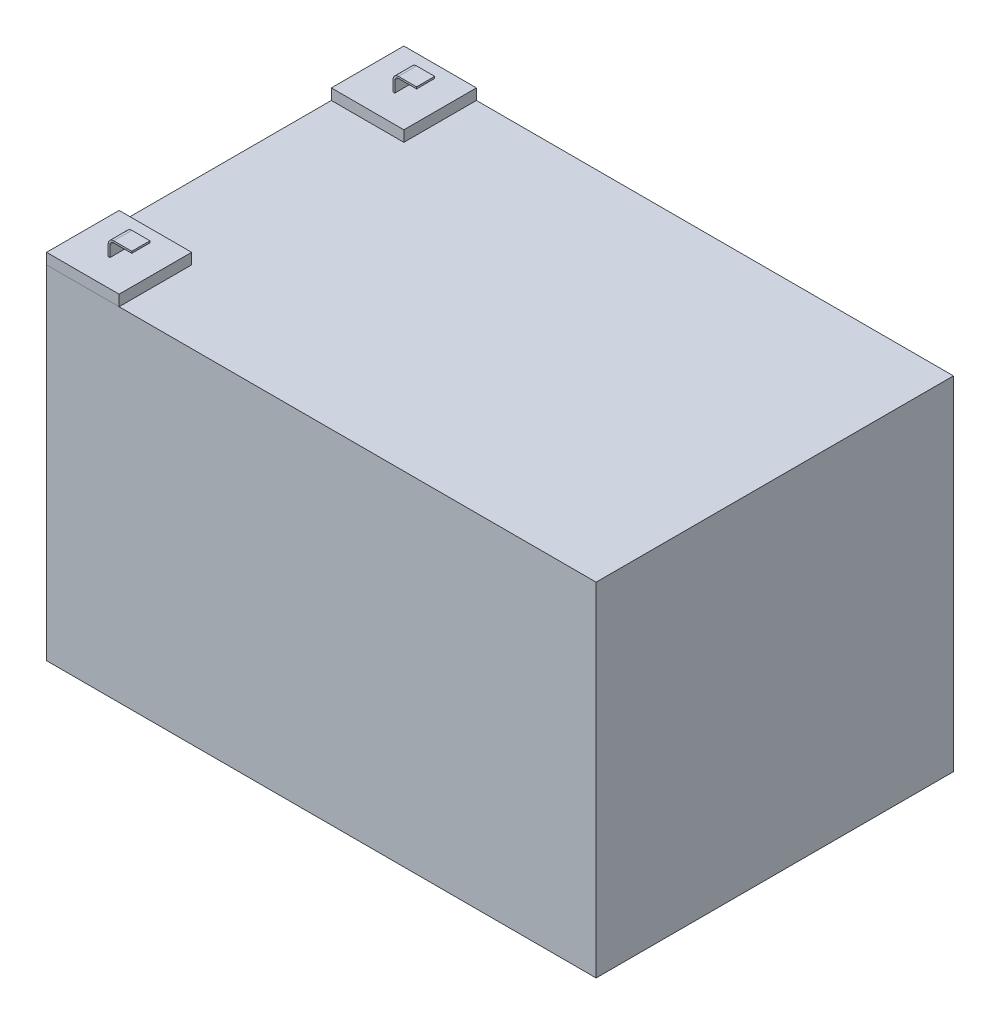
ISO-10303-21;
HEADER;
FILE_DESCRIPTION(('STEP AP214'),'2;1');
FILE_NAME('part.step','',(''),(''),'','','');
FILE_SCHEMA(('AUTOMOTIVE_DESIGN { 1 0 10303 214 1 1 1 1 }'));
ENDSEC;
DATA;
#1=APPLICATION_CONTEXT('core data for automotive mechanical design processes');
#2=APPLICATION_PROTOCOL_DEFINITION('international standard','automotive_design',2000,#1);
#3=PRODUCT_CONTEXT('',#1,'mechanical');
#4=PRODUCT('Part','Part','',(#3));
#5=PRODUCT_RELATED_PRODUCT_CATEGORY('part','',(#4));
#6=PRODUCT_DEFINITION_FORMATION('','',#4);
#7=PRODUCT_DEFINITION_CONTEXT('part definition',#1,'design');
#8=PRODUCT_DEFINITION('design','',#6,#7);
#9=PRODUCT_DEFINITION_SHAPE('','',#8);
#10=(LENGTH_UNIT() NAMED_UNIT(*) SI_UNIT(.MILLI.,.METRE.));
#11=(NAMED_UNIT(*) PLANE_ANGLE_UNIT() SI_UNIT($,.RADIAN.));
#12=(NAMED_UNIT(*) SI_UNIT($,.STERADIAN.) SOLID_ANGLE_UNIT());
#13=UNCERTAINTY_MEASURE_WITH_UNIT(LENGTH_MEASURE(1.E-05),#10,'distance_accuracy_value','');
#14=(GEOMETRIC_REPRESENTATION_CONTEXT(3) GLOBAL_UNCERTAINTY_ASSIGNED_CONTEXT((#13)) GLOBAL_UNIT_ASSIGNED_CONTEXT((#10,
#11,#12)) REPRESENTATION_CONTEXT('',''));
#15=CARTESIAN_POINT('',(0.,0.,0.));
#16=DIRECTION('',(0.,0.,1.));
#17=DIRECTION('',(1.,0.,0.));
#18=AXIS2_PLACEMENT_3D('',#15,#16,#17);
#19=CARTESIAN_POINT('',(-65.75,97.5,-36.75));
#20=DIRECTION('',(0.,-1.,0.));
#21=DIRECTION('',(0.,0.,1.));
#22=AXIS2_PLACEMENT_3D('',#19,#20,#21);
#23=PLANE('',#22);
#24=DIRECTION('',(0.,0.,-1.));
#25=VECTOR('',#24,1.);
#26=CARTESIAN_POINT('',(-65.75,97.5,-36.75));
#27=LINE('',#26,#25);
#28=CARTESIAN_POINT('',(-65.75,97.5,-36.75));
#29=VERTEX_POINT('',#28);
#30=CARTESIAN_POINT('',(-65.75,97.5,-41.75));
#31=VERTEX_POINT('',#30);
#32=EDGE_CURVE('E55',#29,#31,#27,.T.);
#33=ORIENTED_EDGE('',*,*,#32,.F.);
#34=DIRECTION('',(1.,0.,0.));
#35=VECTOR('',#34,1.);
#36=CARTESIAN_POINT('',(-65.75,97.5,-36.75));
#37=LINE('',#36,#35);
#38=CARTESIAN_POINT('',(-66.25,97.5,-36.75));
#39=VERTEX_POINT('',#38);
#40=EDGE_CURVE('E179',#39,#29,#37,.T.);
#41=ORIENTED_EDGE('',*,*,#40,.F.);
#42=DIRECTION('',(0.,0.,-1.));
#43=VECTOR('',#42,1.);
#44=CARTESIAN_POINT('',(-66.25,97.5,-36.75));
#45=LINE('',#44,#43);
#46=CARTESIAN_POINT('',(-66.25,97.5,-41.75));
#47=VERTEX_POINT('',#46);
#48=EDGE_CURVE('E12',#39,#47,#45,.T.);
#49=ORIENTED_EDGE('',*,*,#48,.T.);
#50=DIRECTION('',(1.,0.,0.));
#51=VECTOR('',#50,1.);
#52=CARTESIAN_POINT('',(-65.75,97.5,-41.75));
#53=LINE('',#52,#51);
#54=EDGE_CURVE('E122',#47,#31,#53,.T.);
#55=ORIENTED_EDGE('',*,*,#54,.T.);
#56=EDGE_LOOP('',(#33,#41,#49,#55));
#57=FACE_BOUND('',#56,.T.);
#58=ADVANCED_FACE('F52',(#57),#23,.T.);
#59=CARTESIAN_POINT('',(-66.25,97.5,-36.75));
#60=DIRECTION('',(-1.,0.,0.));
#61=DIRECTION('',(0.,0.,-1.));
#62=AXIS2_PLACEMENT_3D('',#59,#60,#61);
#63=PLANE('',#62);
#64=ORIENTED_EDGE('',*,*,#48,.F.);
#65=DIRECTION('',(0.,-1.,0.));
#66=VECTOR('',#65,1.);
#67=CARTESIAN_POINT('',(-66.25,97.5,-36.75));
#68=LINE('',#67,#66);
#69=CARTESIAN_POINT('',(-66.25,100.5,-36.75));
#70=VERTEX_POINT('',#69);
#71=EDGE_CURVE('E68',#70,#39,#68,.T.);
#72=ORIENTED_EDGE('',*,*,#71,.F.);
#73=DIRECTION('',(0.,0.,-1.));
#74=VECTOR('',#73,1.);
#75=CARTESIAN_POINT('',(-66.25,100.5,-36.75));
#76=LINE('',#75,#74);
#77=CARTESIAN_POINT('',(-66.25,100.5,-41.75));
#78=VERTEX_POINT('',#77);
#79=EDGE_CURVE('E60',#70,#78,#76,.T.);
#80=ORIENTED_EDGE('',*,*,#79,.T.);
#81=DIRECTION('',(0.,-1.,0.));
#82=VECTOR('',#81,1.);
#83=CARTESIAN_POINT('',(-66.25,97.5,-41.75));
#84=LINE('',#83,#82);
#85=EDGE_CURVE('E177',#78,#47,#84,.T.);
#86=ORIENTED_EDGE('',*,*,#85,.T.);
#87=EDGE_LOOP('',(#64,#72,#80,#86));
#88=FACE_BOUND('',#87,.T.);
#89=ADVANCED_FACE('F196',(#88),#63,.T.);
#90=CARTESIAN_POINT('',(-64.75,100.5,-36.75));
#91=DIRECTION('',(0.,0.,-1.));
#92=DIRECTION('',(1.,0.,0.));
#93=AXIS2_PLACEMENT_3D('',#90,#91,#92);
#94=CYLINDRICAL_SURFACE('',#93,1.5);
#95=ORIENTED_EDGE('',*,*,#79,.F.);
#96=CARTESIAN_POINT('',(-64.75,100.5,-36.75));
#97=DIRECTION('',(0.,0.,1.));
#98=DIRECTION('',(-1.,0.,0.));
#99=AXIS2_PLACEMENT_3D('',#96,#97,#98);
#100=CIRCLE('',#99,1.5);
#101=CARTESIAN_POINT('',(-64.75,102.,-36.75));
#102=VERTEX_POINT('',#101);
#103=EDGE_CURVE('E73',#102,#70,#100,.T.);
#104=ORIENTED_EDGE('',*,*,#103,.F.);
#105=DIRECTION('',(0.,0.,-1.));
#106=VECTOR('',#105,1.);
#107=CARTESIAN_POINT('',(-64.75,102.,-36.75));
#108=LINE('',#107,#106);
#109=CARTESIAN_POINT('',(-64.75,102.,-41.75));
#110=VERTEX_POINT('',#109);
#111=EDGE_CURVE('E145',#102,#110,#108,.T.);
#112=ORIENTED_EDGE('',*,*,#111,.T.);
#113=CARTESIAN_POINT('',(-64.75,100.5,-41.75));
#114=DIRECTION('',(0.,0.,1.));
#115=DIRECTION('',(-1.,0.,0.));
#116=AXIS2_PLACEMENT_3D('',#113,#114,#115);
#117=CIRCLE('',#116,1.5);
#118=EDGE_CURVE('E175',#110,#78,#117,.T.);
#119=ORIENTED_EDGE('',*,*,#118,.T.);
#120=EDGE_LOOP('',(#95,#104,#112,#119));
#121=FACE_BOUND('',#120,.T.);
#122=ADVANCED_FACE('F194',(#121),#94,.T.);
#123=CARTESIAN_POINT('',(-64.75,102.,-36.75));
#124=DIRECTION('',(0.,1.,0.));
#125=DIRECTION('',(0.,0.,-1.));
#126=AXIS2_PLACEMENT_3D('',#123,#124,#125);
#127=PLANE('',#126);
#128=ORIENTED_EDGE('',*,*,#111,.F.);
#129=DIRECTION('',(-1.,0.,0.));
#130=VECTOR('',#129,1.);
#131=CARTESIAN_POINT('',(-64.75,102.,-36.75));
#132=LINE('',#131,#130);
#133=CARTESIAN_POINT('',(-59.75,102.,-36.75));
#134=VERTEX_POINT('',#133);
#135=EDGE_CURVE('E139',#134,#102,#132,.T.);
#136=ORIENTED_EDGE('',*,*,#135,.F.);
#137=DIRECTION('',(0.,0.,-1.));
#138=VECTOR('',#137,1.);
#139=CARTESIAN_POINT('',(-59.75,102.,-36.75));
#140=LINE('',#139,#138);
#141=CARTESIAN_POINT('',(-59.75,102.,-41.75));
#142=VERTEX_POINT('',#141);
#143=EDGE_CURVE('E148',#134,#142,#140,.T.);
#144=ORIENTED_EDGE('',*,*,#143,.T.);
#145=DIRECTION('',(-1.,0.,0.));
#146=VECTOR('',#145,1.);
#147=CARTESIAN_POINT('',(-64.75,102.,-41.75));
#148=LINE('',#147,#146);
#149=EDGE_CURVE('E171',#142,#110,#148,.T.);
#150=ORIENTED_EDGE('',*,*,#149,.T.);
#151=EDGE_LOOP('',(#128,#136,#144,#150));
#152=FACE_BOUND('',#151,.T.);
#153=ADVANCED_FACE('F191',(#152),#127,.T.);
#154=CARTESIAN_POINT('',(-59.75,102.,-36.75));
#155=DIRECTION('',(1.,0.,0.));
#156=DIRECTION('',(0.,0.,1.));
#157=AXIS2_PLACEMENT_3D('',#154,#155,#156);
#158=PLANE('',#157);
#159=ORIENTED_EDGE('',*,*,#143,.F.);
#160=DIRECTION('',(0.,1.,0.));
#161=VECTOR('',#160,1.);
#162=CARTESIAN_POINT('',(-59.75,102.,-36.75));
#163=LINE('',#162,#161);
#164=CARTESIAN_POINT('',(-59.75,101.5,-36.75));
#165=VERTEX_POINT('',#164);
#166=EDGE_CURVE('E184',#165,#134,#163,.T.);
#167=ORIENTED_EDGE('',*,*,#166,.F.);
#168=DIRECTION('',(0.,0.,-1.));
#169=VECTOR('',#168,1.);
#170=CARTESIAN_POINT('',(-59.75,101.5,-36.75));
#171=LINE('',#170,#169);
#172=CARTESIAN_POINT('',(-59.75,101.5,-41.75));
#173=VERTEX_POINT('',#172);
#174=EDGE_CURVE('E151',#165,#173,#171,.T.);
#175=ORIENTED_EDGE('',*,*,#174,.T.);
#176=DIRECTION('',(0.,1.,0.));
#177=VECTOR('',#176,1.);
#178=CARTESIAN_POINT('',(-59.75,102.,-41.75));
#179=LINE('',#178,#177);
#180=EDGE_CURVE('E169',#173,#142,#179,.T.);
#181=ORIENTED_EDGE('',*,*,#180,.T.);
#182=EDGE_LOOP('',(#159,#167,#175,#181));
#183=FACE_BOUND('',#182,.T.);
#184=ADVANCED_FACE('F198',(#183),#158,.T.);
#185=CARTESIAN_POINT('',(-64.75,101.5,-36.75));
#186=DIRECTION('',(0.,-1.,0.));
#187=DIRECTION('',(1.,0.,0.));
#188=AXIS2_PLACEMENT_3D('',#185,#186,#187);
#189=PLANE('',#188);
#190=ORIENTED_EDGE('',*,*,#174,.F.);
#191=DIRECTION('',(1.,0.,0.));
#192=VECTOR('',#191,1.);
#193=CARTESIAN_POINT('',(-64.75,101.5,-36.75));
#194=LINE('',#193,#192);
#195=CARTESIAN_POINT('',(-64.75,101.5,-36.75));
#196=VERTEX_POINT('',#195);
#197=EDGE_CURVE('E162',#196,#165,#194,.T.);
#198=ORIENTED_EDGE('',*,*,#197,.F.);
#199=DIRECTION('',(0.,0.,-1.));
#200=VECTOR('',#199,1.);
#201=CARTESIAN_POINT('',(-64.75,101.5,-36.75));
#202=LINE('',#201,#200);
#203=CARTESIAN_POINT('',(-64.75,101.5,-41.75));
#204=VERTEX_POINT('',#203);
#205=EDGE_CURVE('E137',#196,#204,#202,.T.);
#206=ORIENTED_EDGE('',*,*,#205,.T.);
#207=DIRECTION('',(1.,0.,0.));
#208=VECTOR('',#207,1.);
#209=CARTESIAN_POINT('',(-64.75,101.5,-41.75));
#210=LINE('',#209,#208);
#211=EDGE_CURVE('E160',#204,#173,#210,.T.);
#212=ORIENTED_EDGE('',*,*,#211,.T.);
#213=EDGE_LOOP('',(#190,#198,#206,#212));
#214=FACE_BOUND('',#213,.T.);
#215=ADVANCED_FACE('F159',(#214),#189,.T.);
#216=CARTESIAN_POINT('',(-64.75,100.5,-36.75));
#217=DIRECTION('',(0.,0.,-1.));
#218=DIRECTION('',(1.,0.,0.));
#219=AXIS2_PLACEMENT_3D('',#216,#217,#218);
#220=CYLINDRICAL_SURFACE('',#219,0.999999999999994);
#221=ORIENTED_EDGE('',*,*,#205,.F.);
#222=CARTESIAN_POINT('',(-64.75,100.5,-36.75));
#223=DIRECTION('',(0.,0.,-1.));
#224=DIRECTION('',(-1.,0.,0.));
#225=AXIS2_PLACEMENT_3D('',#222,#223,#224);
#226=CIRCLE('',#225,0.999999999999994);
#227=CARTESIAN_POINT('',(-65.75,100.5,-36.75));
#228=VERTEX_POINT('',#227);
#229=EDGE_CURVE('E166',#228,#196,#226,.T.);
#230=ORIENTED_EDGE('',*,*,#229,.F.);
#231=DIRECTION('',(0.,0.,-1.));
#232=VECTOR('',#231,1.);
#233=CARTESIAN_POINT('',(-65.75,100.5,-36.75));
#234=LINE('',#233,#232);
#235=CARTESIAN_POINT('',(-65.75,100.5,-41.75));
#236=VERTEX_POINT('',#235);
#237=EDGE_CURVE('E136',#228,#236,#234,.T.);
#238=ORIENTED_EDGE('',*,*,#237,.T.);
#239=CARTESIAN_POINT('',(-64.75,100.5,-41.75));
#240=DIRECTION('',(0.,0.,-1.));
#241=DIRECTION('',(-1.,0.,0.));
#242=AXIS2_PLACEMENT_3D('',#239,#240,#241);
#243=CIRCLE('',#242,0.999999999999994);
#244=EDGE_CURVE('E124',#236,#204,#243,.T.);
#245=ORIENTED_EDGE('',*,*,#244,.T.);
#246=EDGE_LOOP('',(#221,#230,#238,#245));
#247=FACE_BOUND('',#246,.T.);
#248=ADVANCED_FACE('F165',(#247),#220,.F.);
#249=CARTESIAN_POINT('',(-65.75,97.5,-36.75));
#250=DIRECTION('',(1.,0.,0.));
#251=DIRECTION('',(0.,0.,1.));
#252=AXIS2_PLACEMENT_3D('',#249,#250,#251);
#253=PLANE('',#252);
#254=ORIENTED_EDGE('',*,*,#237,.F.);
#255=DIRECTION('',(0.,1.,0.));
#256=VECTOR('',#255,1.);
#257=CARTESIAN_POINT('',(-65.75,97.5,-36.75));
#258=LINE('',#257,#256);
#259=EDGE_CURVE('E135',#29,#228,#258,.T.);
#260=ORIENTED_EDGE('',*,*,#259,.F.);
#261=ORIENTED_EDGE('',*,*,#32,.T.);
#262=DIRECTION('',(0.,1.,0.));
#263=VECTOR('',#262,1.);
#264=CARTESIAN_POINT('',(-65.75,97.5,-41.75));
#265=LINE('',#264,#263);
#266=EDGE_CURVE('E118',#31,#236,#265,.T.);
#267=ORIENTED_EDGE('',*,*,#266,.T.);
#268=EDGE_LOOP('',(#254,#260,#261,#267));
#269=FACE_BOUND('',#268,.T.);
#270=ADVANCED_FACE('F134',(#269),#253,.T.);
#271=CARTESIAN_POINT('',(-64.75,100.5,-36.75));
#272=DIRECTION('',(0.,0.,1.));
#273=DIRECTION('',(-1.,0.,0.));
#274=AXIS2_PLACEMENT_3D('',#271,#272,#273);
#275=PLANE('',#274);
#276=ORIENTED_EDGE('',*,*,#40,.T.);
#277=ORIENTED_EDGE('',*,*,#259,.T.);
#278=ORIENTED_EDGE('',*,*,#229,.T.);
#279=ORIENTED_EDGE('',*,*,#197,.T.);
#280=ORIENTED_EDGE('',*,*,#166,.T.);
#281=ORIENTED_EDGE('',*,*,#135,.T.);
#282=ORIENTED_EDGE('',*,*,#103,.T.);
#283=ORIENTED_EDGE('',*,*,#71,.T.);
#284=EDGE_LOOP('',(#276,#277,#278,#279,#280,#281,#282,#283));
#285=FACE_BOUND('',#284,.T.);
#286=ADVANCED_FACE('F187',(#285),#275,.T.);
#287=CARTESIAN_POINT('',(-64.75,100.5,-41.75));
#288=DIRECTION('',(0.,0.,1.));
#289=DIRECTION('',(-1.,0.,0.));
#290=AXIS2_PLACEMENT_3D('',#287,#288,#289);
#291=PLANE('',#290);
#292=ORIENTED_EDGE('',*,*,#54,.F.);
#293=ORIENTED_EDGE('',*,*,#85,.F.);
#294=ORIENTED_EDGE('',*,*,#118,.F.);
#295=ORIENTED_EDGE('',*,*,#149,.F.);
#296=ORIENTED_EDGE('',*,*,#180,.F.);
#297=ORIENTED_EDGE('',*,*,#211,.F.);
#298=ORIENTED_EDGE('',*,*,#244,.F.);
#299=ORIENTED_EDGE('',*,*,#266,.F.);
#300=EDGE_LOOP('',(#292,#293,#294,#295,#296,#297,#298,#299));
#301=FACE_BOUND('',#300,.T.);
#302=ADVANCED_FACE('F120',(#301),#291,.F.);
#303=CLOSED_SHELL('',(#58,#89,#122,#153,#184,#215,#248,#270,#286,#302));
#304=MANIFOLD_SOLID_BREP('B2',#303);
#305=CARTESIAN_POINT('',(-65.75,97.5,36.75));
#306=DIRECTION('',(0.,-1.,0.));
#307=DIRECTION('',(0.,0.,-1.));
#308=AXIS2_PLACEMENT_3D('',#305,#306,#307);
#309=PLANE('',#308);
#310=DIRECTION('',(0.,0.,1.));
#311=VECTOR('',#310,1.);
#312=CARTESIAN_POINT('',(-65.75,97.5,36.75));
#313=LINE('',#312,#311);
#314=CARTESIAN_POINT('',(-65.75,97.5,36.75));
#315=VERTEX_POINT('',#314);
#316=CARTESIAN_POINT('',(-65.75,97.5,41.75));
#317=VERTEX_POINT('',#316);
#318=EDGE_CURVE('E313',#315,#317,#313,.T.);
#319=ORIENTED_EDGE('',*,*,#318,.T.);
#320=DIRECTION('',(1.,0.,0.));
#321=VECTOR('',#320,1.);
#322=CARTESIAN_POINT('',(-65.75,97.5,41.75));
#323=LINE('',#322,#321);
#324=CARTESIAN_POINT('',(-66.25,97.5,41.75));
#325=VERTEX_POINT('',#324);
#326=EDGE_CURVE('E374',#325,#317,#323,.T.);
#327=ORIENTED_EDGE('',*,*,#326,.F.);
#328=DIRECTION('',(0.,0.,1.));
#329=VECTOR('',#328,1.);
#330=CARTESIAN_POINT('',(-66.25,97.5,36.75));
#331=LINE('',#330,#329);
#332=CARTESIAN_POINT('',(-66.25,97.5,36.75));
#333=VERTEX_POINT('',#332);
#334=EDGE_CURVE('E50',#333,#325,#331,.T.);
#335=ORIENTED_EDGE('',*,*,#334,.F.);
#336=DIRECTION('',(1.,0.,0.));
#337=VECTOR('',#336,1.);
#338=CARTESIAN_POINT('',(-65.75,97.5,36.75));
#339=LINE('',#338,#337);
#340=EDGE_CURVE('E375',#333,#315,#339,.T.);
#341=ORIENTED_EDGE('',*,*,#340,.T.);
#342=EDGE_LOOP('',(#319,#327,#335,#341));
#343=FACE_BOUND('',#342,.T.);
#344=ADVANCED_FACE('F310',(#343),#309,.T.);
#345=CARTESIAN_POINT('',(-66.25,97.5,36.75));
#346=DIRECTION('',(-1.,0.,0.));
#347=DIRECTION('',(0.,0.,1.));
#348=AXIS2_PLACEMENT_3D('',#345,#346,#347);
#349=PLANE('',#348);
#350=ORIENTED_EDGE('',*,*,#334,.T.);
#351=DIRECTION('',(0.,-1.,0.));
#352=VECTOR('',#351,1.);
#353=CARTESIAN_POINT('',(-66.25,97.5,41.75));
#354=LINE('',#353,#352);
#355=CARTESIAN_POINT('',(-66.25,100.5,41.75));
#356=VERTEX_POINT('',#355);
#357=EDGE_CURVE('E392',#356,#325,#354,.T.);
#358=ORIENTED_EDGE('',*,*,#357,.F.);
#359=DIRECTION('',(0.,0.,1.));
#360=VECTOR('',#359,1.);
#361=CARTESIAN_POINT('',(-66.25,100.5,36.75));
#362=LINE('',#361,#360);
#363=CARTESIAN_POINT('',(-66.25,100.5,36.75));
#364=VERTEX_POINT('',#363);
#365=EDGE_CURVE('E318',#364,#356,#362,.T.);
#366=ORIENTED_EDGE('',*,*,#365,.F.);
#367=DIRECTION('',(0.,-1.,0.));
#368=VECTOR('',#367,1.);
#369=CARTESIAN_POINT('',(-66.25,97.5,36.75));
#370=LINE('',#369,#368);
#371=EDGE_CURVE('E380',#364,#333,#370,.T.);
#372=ORIENTED_EDGE('',*,*,#371,.T.);
#373=EDGE_LOOP('',(#350,#358,#366,#372));
#374=FACE_BOUND('',#373,.T.);
#375=ADVANCED_FACE('F456',(#374),#349,.T.);
#376=CARTESIAN_POINT('',(-64.75,100.5,36.75));
#377=DIRECTION('',(0.,0.,1.));
#378=DIRECTION('',(1.,0.,0.));
#379=AXIS2_PLACEMENT_3D('',#376,#377,#378);
#380=CYLINDRICAL_SURFACE('',#379,1.5);
#381=ORIENTED_EDGE('',*,*,#365,.T.);
#382=CARTESIAN_POINT('',(-64.75,100.5,41.75));
#383=DIRECTION('',(0.,0.,1.));
#384=DIRECTION('',(-1.,0.,0.));
#385=AXIS2_PLACEMENT_3D('',#382,#383,#384);
#386=CIRCLE('',#385,1.5);
#387=CARTESIAN_POINT('',(-64.75,102.,41.75));
#388=VERTEX_POINT('',#387);
#389=EDGE_CURVE('E405',#388,#356,#386,.T.);
#390=ORIENTED_EDGE('',*,*,#389,.F.);
#391=DIRECTION('',(0.,0.,1.));
#392=VECTOR('',#391,1.);
#393=CARTESIAN_POINT('',(-64.75,102.,36.75));
#394=LINE('',#393,#392);
#395=CARTESIAN_POINT('',(-64.75,102.,36.75));
#396=VERTEX_POINT('',#395);
#397=EDGE_CURVE('E427',#396,#388,#394,.T.);
#398=ORIENTED_EDGE('',*,*,#397,.F.);
#399=CARTESIAN_POINT('',(-64.75,100.5,36.75));
#400=DIRECTION('',(0.,0.,1.));
#401=DIRECTION('',(-1.,0.,0.));
#402=AXIS2_PLACEMENT_3D('',#399,#400,#401);
#403=CIRCLE('',#402,1.5);
#404=EDGE_CURVE('E423',#396,#364,#403,.T.);
#405=ORIENTED_EDGE('',*,*,#404,.T.);
#406=EDGE_LOOP('',(#381,#390,#398,#405));
#407=FACE_BOUND('',#406,.T.);
#408=ADVANCED_FACE('F455',(#407),#380,.T.);
#409=CARTESIAN_POINT('',(-64.75,102.,36.75));
#410=DIRECTION('',(0.,1.,0.));
#411=DIRECTION('',(0.,0.,1.));
#412=AXIS2_PLACEMENT_3D('',#409,#410,#411);
#413=PLANE('',#412);
#414=ORIENTED_EDGE('',*,*,#397,.T.);
#415=DIRECTION('',(-1.,0.,0.));
#416=VECTOR('',#415,1.);
#417=CARTESIAN_POINT('',(-64.75,102.,41.75));
#418=LINE('',#417,#416);
#419=CARTESIAN_POINT('',(-59.75,102.,41.75));
#420=VERTEX_POINT('',#419);
#421=EDGE_CURVE('E402',#420,#388,#418,.T.);
#422=ORIENTED_EDGE('',*,*,#421,.F.);
#423=DIRECTION('',(0.,0.,1.));
#424=VECTOR('',#423,1.);
#425=CARTESIAN_POINT('',(-59.75,102.,36.75));
#426=LINE('',#425,#424);
#427=CARTESIAN_POINT('',(-59.75,102.,36.75));
#428=VERTEX_POINT('',#427);
#429=EDGE_CURVE('E429',#428,#420,#426,.T.);
#430=ORIENTED_EDGE('',*,*,#429,.F.);
#431=DIRECTION('',(-1.,0.,0.));
#432=VECTOR('',#431,1.);
#433=CARTESIAN_POINT('',(-64.75,102.,36.75));
#434=LINE('',#433,#432);
#435=EDGE_CURVE('E420',#428,#396,#434,.T.);
#436=ORIENTED_EDGE('',*,*,#435,.T.);
#437=EDGE_LOOP('',(#414,#422,#430,#436));
#438=FACE_BOUND('',#437,.T.);
#439=ADVANCED_FACE('F451',(#438),#413,.T.);
#440=CARTESIAN_POINT('',(-59.75,102.,36.75));
#441=DIRECTION('',(1.,0.,0.));
#442=DIRECTION('',(0.,0.,-1.));
#443=AXIS2_PLACEMENT_3D('',#440,#441,#442);
#444=PLANE('',#443);
#445=ORIENTED_EDGE('',*,*,#429,.T.);
#446=DIRECTION('',(0.,1.,0.));
#447=VECTOR('',#446,1.);
#448=CARTESIAN_POINT('',(-59.75,102.,41.75));
#449=LINE('',#448,#447);
#450=CARTESIAN_POINT('',(-59.75,101.5,41.75));
#451=VERTEX_POINT('',#450);
#452=EDGE_CURVE('E399',#451,#420,#449,.T.);
#453=ORIENTED_EDGE('',*,*,#452,.F.);
#454=DIRECTION('',(0.,0.,1.));
#455=VECTOR('',#454,1.);
#456=CARTESIAN_POINT('',(-59.75,101.5,36.75));
#457=LINE('',#456,#455);
#458=CARTESIAN_POINT('',(-59.75,101.5,36.75));
#459=VERTEX_POINT('',#458);
#460=EDGE_CURVE('E431',#459,#451,#457,.T.);
#461=ORIENTED_EDGE('',*,*,#460,.F.);
#462=DIRECTION('',(0.,1.,0.));
#463=VECTOR('',#462,1.);
#464=CARTESIAN_POINT('',(-59.75,102.,36.75));
#465=LINE('',#464,#463);
#466=EDGE_CURVE('E417',#459,#428,#465,.T.);
#467=ORIENTED_EDGE('',*,*,#466,.T.);
#468=EDGE_LOOP('',(#445,#453,#461,#467));
#469=FACE_BOUND('',#468,.T.);
#470=ADVANCED_FACE('F444',(#469),#444,.T.);
#471=CARTESIAN_POINT('',(-64.75,101.5,36.75));
#472=DIRECTION('',(0.,-1.,0.));
#473=DIRECTION('',(1.,0.,0.));
#474=AXIS2_PLACEMENT_3D('',#471,#472,#473);
#475=PLANE('',#474);
#476=ORIENTED_EDGE('',*,*,#460,.T.);
#477=DIRECTION('',(1.,0.,0.));
#478=VECTOR('',#477,1.);
#479=CARTESIAN_POINT('',(-64.75,101.5,41.75));
#480=LINE('',#479,#478);
#481=CARTESIAN_POINT('',(-64.75,101.5,41.75));
#482=VERTEX_POINT('',#481);
#483=EDGE_CURVE('E396',#482,#451,#480,.T.);
#484=ORIENTED_EDGE('',*,*,#483,.F.);
#485=DIRECTION('',(0.,0.,1.));
#486=VECTOR('',#485,1.);
#487=CARTESIAN_POINT('',(-64.75,101.5,36.75));
#488=LINE('',#487,#486);
#489=CARTESIAN_POINT('',(-64.75,101.5,36.75));
#490=VERTEX_POINT('',#489);
#491=EDGE_CURVE('E433',#490,#482,#488,.T.);
#492=ORIENTED_EDGE('',*,*,#491,.F.);
#493=DIRECTION('',(1.,0.,0.));
#494=VECTOR('',#493,1.);
#495=CARTESIAN_POINT('',(-64.75,101.5,36.75));
#496=LINE('',#495,#494);
#497=EDGE_CURVE('E414',#490,#459,#496,.T.);
#498=ORIENTED_EDGE('',*,*,#497,.T.);
#499=EDGE_LOOP('',(#476,#484,#492,#498));
#500=FACE_BOUND('',#499,.T.);
#501=ADVANCED_FACE('F441',(#500),#475,.T.);
#502=CARTESIAN_POINT('',(-64.75,100.5,36.75));
#503=DIRECTION('',(0.,0.,1.));
#504=DIRECTION('',(1.,0.,0.));
#505=AXIS2_PLACEMENT_3D('',#502,#503,#504);
#506=CYLINDRICAL_SURFACE('',#505,0.999999999999994);
#507=ORIENTED_EDGE('',*,*,#491,.T.);
#508=CARTESIAN_POINT('',(-64.75,100.5,41.75));
#509=DIRECTION('',(0.,0.,-1.));
#510=DIRECTION('',(-1.,0.,0.));
#511=AXIS2_PLACEMENT_3D('',#508,#509,#510);
#512=CIRCLE('',#511,0.999999999999994);
#513=CARTESIAN_POINT('',(-65.75,100.5,41.75));
#514=VERTEX_POINT('',#513);
#515=EDGE_CURVE('E387',#514,#482,#512,.T.);
#516=ORIENTED_EDGE('',*,*,#515,.F.);
#517=DIRECTION('',(0.,0.,1.));
#518=VECTOR('',#517,1.);
#519=CARTESIAN_POINT('',(-65.75,100.5,36.75));
#520=LINE('',#519,#518);
#521=CARTESIAN_POINT('',(-65.75,100.5,36.75));
#522=VERTEX_POINT('',#521);
#523=EDGE_CURVE('E379',#522,#514,#520,.T.);
#524=ORIENTED_EDGE('',*,*,#523,.F.);
#525=CARTESIAN_POINT('',(-64.75,100.5,36.75));
#526=DIRECTION('',(0.,0.,-1.));
#527=DIRECTION('',(-1.,0.,0.));
#528=AXIS2_PLACEMENT_3D('',#525,#526,#527);
#529=CIRCLE('',#528,0.999999999999994);
#530=EDGE_CURVE('E411',#522,#490,#529,.T.);
#531=ORIENTED_EDGE('',*,*,#530,.T.);
#532=EDGE_LOOP('',(#507,#516,#524,#531));
#533=FACE_BOUND('',#532,.T.);
#534=ADVANCED_FACE('F435',(#533),#506,.F.);
#535=CARTESIAN_POINT('',(-65.75,97.5,36.75));
#536=DIRECTION('',(1.,0.,0.));
#537=DIRECTION('',(0.,0.,-1.));
#538=AXIS2_PLACEMENT_3D('',#535,#536,#537);
#539=PLANE('',#538);
#540=ORIENTED_EDGE('',*,*,#523,.T.);
#541=DIRECTION('',(0.,1.,0.));
#542=VECTOR('',#541,1.);
#543=CARTESIAN_POINT('',(-65.75,97.5,41.75));
#544=LINE('',#543,#542);
#545=EDGE_CURVE('E382',#317,#514,#544,.T.);
#546=ORIENTED_EDGE('',*,*,#545,.F.);
#547=ORIENTED_EDGE('',*,*,#318,.F.);
#548=DIRECTION('',(0.,1.,0.));
#549=VECTOR('',#548,1.);
#550=CARTESIAN_POINT('',(-65.75,97.5,36.75));
#551=LINE('',#550,#549);
#552=EDGE_CURVE('E409',#315,#522,#551,.T.);
#553=ORIENTED_EDGE('',*,*,#552,.T.);
#554=EDGE_LOOP('',(#540,#546,#547,#553));
#555=FACE_BOUND('',#554,.T.);
#556=ADVANCED_FACE('F383',(#555),#539,.T.);
#557=CARTESIAN_POINT('',(-64.75,100.5,36.75));
#558=DIRECTION('',(0.,0.,-1.));
#559=DIRECTION('',(-1.,0.,0.));
#560=AXIS2_PLACEMENT_3D('',#557,#558,#559);
#561=PLANE('',#560);
#562=ORIENTED_EDGE('',*,*,#340,.F.);
#563=ORIENTED_EDGE('',*,*,#371,.F.);
#564=ORIENTED_EDGE('',*,*,#404,.F.);
#565=ORIENTED_EDGE('',*,*,#435,.F.);
#566=ORIENTED_EDGE('',*,*,#466,.F.);
#567=ORIENTED_EDGE('',*,*,#497,.F.);
#568=ORIENTED_EDGE('',*,*,#530,.F.);
#569=ORIENTED_EDGE('',*,*,#552,.F.);
#570=EDGE_LOOP('',(#562,#563,#564,#565,#566,#567,#568,#569));
#571=FACE_BOUND('',#570,.T.);
#572=ADVANCED_FACE('F447',(#571),#561,.T.);
#573=CARTESIAN_POINT('',(-64.75,100.5,41.75));
#574=DIRECTION('',(0.,0.,-1.));
#575=DIRECTION('',(-1.,0.,0.));
#576=AXIS2_PLACEMENT_3D('',#573,#574,#575);
#577=PLANE('',#576);
#578=ORIENTED_EDGE('',*,*,#326,.T.);
#579=ORIENTED_EDGE('',*,*,#545,.T.);
#580=ORIENTED_EDGE('',*,*,#515,.T.);
#581=ORIENTED_EDGE('',*,*,#483,.T.);
#582=ORIENTED_EDGE('',*,*,#452,.T.);
#583=ORIENTED_EDGE('',*,*,#421,.T.);
#584=ORIENTED_EDGE('',*,*,#389,.T.);
#585=ORIENTED_EDGE('',*,*,#357,.T.);
#586=EDGE_LOOP('',(#578,#579,#580,#581,#582,#583,#584,#585));
#587=FACE_BOUND('',#586,.T.);
#588=ADVANCED_FACE('F390',(#587),#577,.F.);
#589=CLOSED_SHELL('',(#344,#375,#408,#439,#470,#501,#534,#556,#572,#588));
#590=MANIFOLD_SOLID_BREP('B6',#589);
#591=CARTESIAN_POINT('',(-75.75,97.5,-49.25));
#592=DIRECTION('',(0.,0.,1.));
#593=DIRECTION('',(1.,0.,0.));
#594=AXIS2_PLACEMENT_3D('',#591,#592,#593);
#595=PLANE('',#594);
#596=DIRECTION('',(-1.,0.,0.));
#597=VECTOR('',#596,1.);
#598=CARTESIAN_POINT('',(-75.75,94.5,-49.25));
#599=LINE('',#598,#597);
#600=CARTESIAN_POINT('',(-55.75,94.5,-49.25));
#601=VERTEX_POINT('',#600);
#602=CARTESIAN_POINT('',(-75.75,94.5,-49.25));
#603=VERTEX_POINT('',#602);
#604=EDGE_CURVE('E611',#601,#603,#599,.T.);
#605=ORIENTED_EDGE('',*,*,#604,.T.);
#606=DIRECTION('',(0.,-1.,0.));
#607=VECTOR('',#606,1.);
#608=CARTESIAN_POINT('',(-75.75,97.5,-49.25));
#609=LINE('',#608,#607);
#610=CARTESIAN_POINT('',(-75.75,97.5,-49.25));
#611=VERTEX_POINT('',#610);
#612=EDGE_CURVE('E308',#611,#603,#609,.T.);
#613=ORIENTED_EDGE('',*,*,#612,.F.);
#614=DIRECTION('',(-1.,0.,0.));
#615=VECTOR('',#614,1.);
#616=CARTESIAN_POINT('',(-75.75,97.5,-49.25));
#617=LINE('',#616,#615);
#618=CARTESIAN_POINT('',(-55.75,97.5,-49.25));
#619=VERTEX_POINT('',#618);
#620=EDGE_CURVE('E599',#619,#611,#617,.T.);
#621=ORIENTED_EDGE('',*,*,#620,.F.);
#622=DIRECTION('',(0.,-1.,0.));
#623=VECTOR('',#622,1.);
#624=CARTESIAN_POINT('',(-55.75,97.5,-49.25));
#625=LINE('',#624,#623);
#626=EDGE_CURVE('E607',#619,#601,#625,.T.);
#627=ORIENTED_EDGE('',*,*,#626,.T.);
#628=EDGE_LOOP('',(#605,#613,#621,#627));
#629=FACE_BOUND('',#628,.T.);
#630=ADVANCED_FACE('F548',(#629),#595,.F.);
#631=CARTESIAN_POINT('',(-75.75,97.5,-49.25));
#632=DIRECTION('',(1.,0.,0.));
#633=DIRECTION('',(0.,0.,-1.));
#634=AXIS2_PLACEMENT_3D('',#631,#632,#633);
#635=PLANE('',#634);
#636=DIRECTION('',(0.,0.,1.));
#637=VECTOR('',#636,1.);
#638=CARTESIAN_POINT('',(-75.75,94.5,-49.25));
#639=LINE('',#638,#637);
#640=CARTESIAN_POINT('',(-75.75,94.5,-29.25));
#641=VERTEX_POINT('',#640);
#642=EDGE_CURVE('E603',#603,#641,#639,.T.);
#643=ORIENTED_EDGE('',*,*,#642,.T.);
#644=DIRECTION('',(0.,-1.,0.));
#645=VECTOR('',#644,1.);
#646=CARTESIAN_POINT('',(-75.75,97.5,-29.25));
#647=LINE('',#646,#645);
#648=CARTESIAN_POINT('',(-75.75,97.5,-29.25));
#649=VERTEX_POINT('',#648);
#650=EDGE_CURVE('E556',#649,#641,#647,.T.);
#651=ORIENTED_EDGE('',*,*,#650,.F.);
#652=DIRECTION('',(0.,0.,1.));
#653=VECTOR('',#652,1.);
#654=CARTESIAN_POINT('',(-75.75,97.5,-49.25));
#655=LINE('',#654,#653);
#656=EDGE_CURVE('E594',#611,#649,#655,.T.);
#657=ORIENTED_EDGE('',*,*,#656,.F.);
#658=ORIENTED_EDGE('',*,*,#612,.T.);
#659=EDGE_LOOP('',(#643,#651,#657,#658));
#660=FACE_BOUND('',#659,.T.);
#661=ADVANCED_FACE('F602',(#660),#635,.F.);
#662=CARTESIAN_POINT('',(-75.75,97.5,-29.25));
#663=DIRECTION('',(0.,0.,-1.));
#664=DIRECTION('',(-1.,0.,0.));
#665=AXIS2_PLACEMENT_3D('',#662,#663,#664);
#666=PLANE('',#665);
#667=DIRECTION('',(1.,0.,0.));
#668=VECTOR('',#667,1.);
#669=CARTESIAN_POINT('',(-75.75,94.5,-29.25));
#670=LINE('',#669,#668);
#671=CARTESIAN_POINT('',(-55.75,94.5,-29.25));
#672=VERTEX_POINT('',#671);
#673=EDGE_CURVE('E581',#641,#672,#670,.T.);
#674=ORIENTED_EDGE('',*,*,#673,.T.);
#675=DIRECTION('',(0.,-1.,0.));
#676=VECTOR('',#675,1.);
#677=CARTESIAN_POINT('',(-55.75,97.5,-29.25));
#678=LINE('',#677,#676);
#679=CARTESIAN_POINT('',(-55.75,97.5,-29.25));
#680=VERTEX_POINT('',#679);
#681=EDGE_CURVE('E604',#680,#672,#678,.T.);
#682=ORIENTED_EDGE('',*,*,#681,.F.);
#683=DIRECTION('',(1.,0.,0.));
#684=VECTOR('',#683,1.);
#685=CARTESIAN_POINT('',(-75.75,97.5,-29.25));
#686=LINE('',#685,#684);
#687=EDGE_CURVE('E597',#649,#680,#686,.T.);
#688=ORIENTED_EDGE('',*,*,#687,.F.);
#689=ORIENTED_EDGE('',*,*,#650,.T.);
#690=EDGE_LOOP('',(#674,#682,#688,#689));
#691=FACE_BOUND('',#690,.T.);
#692=ADVANCED_FACE('F605',(#691),#666,.F.);
#693=CARTESIAN_POINT('',(-55.75,97.5,-49.25));
#694=DIRECTION('',(-1.,0.,0.));
#695=DIRECTION('',(0.,0.,1.));
#696=AXIS2_PLACEMENT_3D('',#693,#694,#695);
#697=PLANE('',#696);
#698=DIRECTION('',(0.,0.,-1.));
#699=VECTOR('',#698,1.);
#700=CARTESIAN_POINT('',(-55.75,94.5,-49.25));
#701=LINE('',#700,#699);
#702=EDGE_CURVE('E587',#672,#601,#701,.T.);
#703=ORIENTED_EDGE('',*,*,#702,.T.);
#704=ORIENTED_EDGE('',*,*,#626,.F.);
#705=DIRECTION('',(0.,0.,-1.));
#706=VECTOR('',#705,1.);
#707=CARTESIAN_POINT('',(-55.75,97.5,-49.25));
#708=LINE('',#707,#706);
#709=EDGE_CURVE('E564',#680,#619,#708,.T.);
#710=ORIENTED_EDGE('',*,*,#709,.F.);
#711=ORIENTED_EDGE('',*,*,#681,.T.);
#712=EDGE_LOOP('',(#703,#704,#710,#711));
#713=FACE_BOUND('',#712,.T.);
#714=ADVANCED_FACE('F618',(#713),#697,.F.);
#715=CARTESIAN_POINT('',(0.,97.5,0.));
#716=DIRECTION('',(0.,-1.,0.));
#717=DIRECTION('',(0.,0.,-1.));
#718=AXIS2_PLACEMENT_3D('',#715,#716,#717);
#719=PLANE('',#718);
#720=ORIENTED_EDGE('',*,*,#620,.T.);
#721=ORIENTED_EDGE('',*,*,#656,.T.);
#722=ORIENTED_EDGE('',*,*,#687,.T.);
#723=ORIENTED_EDGE('',*,*,#709,.T.);
#724=EDGE_LOOP('',(#720,#721,#722,#723));
#725=FACE_BOUND('',#724,.T.);
#726=ADVANCED_FACE('F595',(#725),#719,.F.);
#727=CARTESIAN_POINT('',(0.,94.5,0.));
#728=DIRECTION('',(0.,-1.,0.));
#729=DIRECTION('',(0.,0.,-1.));
#730=AXIS2_PLACEMENT_3D('',#727,#728,#729);
#731=PLANE('',#730);
#732=ORIENTED_EDGE('',*,*,#604,.F.);
#733=ORIENTED_EDGE('',*,*,#702,.F.);
#734=ORIENTED_EDGE('',*,*,#673,.F.);
#735=ORIENTED_EDGE('',*,*,#642,.F.);
#736=EDGE_LOOP('',(#732,#733,#734,#735));
#737=FACE_BOUND('',#736,.T.);
#738=ADVANCED_FACE('F621',(#737),#731,.T.);
#739=CLOSED_SHELL('',(#630,#661,#692,#714,#726,#738));
#740=MANIFOLD_SOLID_BREP('B44',#739);
#741=CARTESIAN_POINT('',(-75.75,97.5,49.25));
#742=DIRECTION('',(1.,0.,0.));
#743=DIRECTION('',(0.,0.,-1.));
#744=AXIS2_PLACEMENT_3D('',#741,#742,#743);
#745=PLANE('',#744);
#746=DIRECTION('',(0.,0.,1.));
#747=VECTOR('',#746,1.);
#748=CARTESIAN_POINT('',(-75.75,94.5,49.25));
#749=LINE('',#748,#747);
#750=CARTESIAN_POINT('',(-75.75,94.5,29.25));
#751=VERTEX_POINT('',#750);
#752=CARTESIAN_POINT('',(-75.75,94.5,49.25));
#753=VERTEX_POINT('',#752);
#754=EDGE_CURVE('E767',#751,#753,#749,.T.);
#755=ORIENTED_EDGE('',*,*,#754,.T.);
#756=DIRECTION('',(0.,-1.,0.));
#757=VECTOR('',#756,1.);
#758=CARTESIAN_POINT('',(-75.75,97.5,49.25));
#759=LINE('',#758,#757);
#760=CARTESIAN_POINT('',(-75.75,97.5,49.25));
#761=VERTEX_POINT('',#760);
#762=EDGE_CURVE('E546',#761,#753,#759,.T.);
#763=ORIENTED_EDGE('',*,*,#762,.F.);
#764=DIRECTION('',(0.,0.,1.));
#765=VECTOR('',#764,1.);
#766=CARTESIAN_POINT('',(-75.75,97.5,49.25));
#767=LINE('',#766,#765);
#768=CARTESIAN_POINT('',(-75.75,97.5,29.25));
#769=VERTEX_POINT('',#768);
#770=EDGE_CURVE('E755',#769,#761,#767,.T.);
#771=ORIENTED_EDGE('',*,*,#770,.F.);
#772=DIRECTION('',(0.,-1.,0.));
#773=VECTOR('',#772,1.);
#774=CARTESIAN_POINT('',(-75.75,97.5,29.25));
#775=LINE('',#774,#773);
#776=EDGE_CURVE('E763',#769,#751,#775,.T.);
#777=ORIENTED_EDGE('',*,*,#776,.T.);
#778=EDGE_LOOP('',(#755,#763,#771,#777));
#779=FACE_BOUND('',#778,.T.);
#780=ADVANCED_FACE('F704',(#779),#745,.F.);
#781=CARTESIAN_POINT('',(-75.75,97.5,49.25));
#782=DIRECTION('',(0.,0.,-1.));
#783=DIRECTION('',(-1.,0.,0.));
#784=AXIS2_PLACEMENT_3D('',#781,#782,#783);
#785=PLANE('',#784);
#786=DIRECTION('',(1.,0.,0.));
#787=VECTOR('',#786,1.);
#788=CARTESIAN_POINT('',(-75.75,94.5,49.25));
#789=LINE('',#788,#787);
#790=CARTESIAN_POINT('',(-55.75,94.5,49.25));
#791=VERTEX_POINT('',#790);
#792=EDGE_CURVE('E759',#753,#791,#789,.T.);
#793=ORIENTED_EDGE('',*,*,#792,.T.);
#794=DIRECTION('',(0.,-1.,0.));
#795=VECTOR('',#794,1.);
#796=CARTESIAN_POINT('',(-55.75,97.5,49.25));
#797=LINE('',#796,#795);
#798=CARTESIAN_POINT('',(-55.75,97.5,49.25));
#799=VERTEX_POINT('',#798);
#800=EDGE_CURVE('E712',#799,#791,#797,.T.);
#801=ORIENTED_EDGE('',*,*,#800,.F.);
#802=DIRECTION('',(1.,0.,0.));
#803=VECTOR('',#802,1.);
#804=CARTESIAN_POINT('',(-75.75,97.5,49.25));
#805=LINE('',#804,#803);
#806=EDGE_CURVE('E750',#761,#799,#805,.T.);
#807=ORIENTED_EDGE('',*,*,#806,.F.);
#808=ORIENTED_EDGE('',*,*,#762,.T.);
#809=EDGE_LOOP('',(#793,#801,#807,#808));
#810=FACE_BOUND('',#809,.T.);
#811=ADVANCED_FACE('F758',(#810),#785,.F.);
#812=CARTESIAN_POINT('',(-55.75,97.5,49.25));
#813=DIRECTION('',(-1.,0.,0.));
#814=DIRECTION('',(0.,0.,1.));
#815=AXIS2_PLACEMENT_3D('',#812,#813,#814);
#816=PLANE('',#815);
#817=DIRECTION('',(0.,0.,-1.));
#818=VECTOR('',#817,1.);
#819=CARTESIAN_POINT('',(-55.75,94.5,49.25));
#820=LINE('',#819,#818);
#821=CARTESIAN_POINT('',(-55.75,94.5,29.25));
#822=VERTEX_POINT('',#821);
#823=EDGE_CURVE('E737',#791,#822,#820,.T.);
#824=ORIENTED_EDGE('',*,*,#823,.T.);
#825=DIRECTION('',(0.,-1.,0.));
#826=VECTOR('',#825,1.);
#827=CARTESIAN_POINT('',(-55.75,97.5,29.25));
#828=LINE('',#827,#826);
#829=CARTESIAN_POINT('',(-55.75,97.5,29.25));
#830=VERTEX_POINT('',#829);
#831=EDGE_CURVE('E760',#830,#822,#828,.T.);
#832=ORIENTED_EDGE('',*,*,#831,.F.);
#833=DIRECTION('',(0.,0.,-1.));
#834=VECTOR('',#833,1.);
#835=CARTESIAN_POINT('',(-55.75,97.5,49.25));
#836=LINE('',#835,#834);
#837=EDGE_CURVE('E753',#799,#830,#836,.T.);
#838=ORIENTED_EDGE('',*,*,#837,.F.);
#839=ORIENTED_EDGE('',*,*,#800,.T.);
#840=EDGE_LOOP('',(#824,#832,#838,#839));
#841=FACE_BOUND('',#840,.T.);
#842=ADVANCED_FACE('F761',(#841),#816,.F.);
#843=CARTESIAN_POINT('',(-75.75,97.5,29.25));
#844=DIRECTION('',(0.,0.,1.));
#845=DIRECTION('',(1.,0.,0.));
#846=AXIS2_PLACEMENT_3D('',#843,#844,#845);
#847=PLANE('',#846);
#848=DIRECTION('',(-1.,0.,0.));
#849=VECTOR('',#848,1.);
#850=CARTESIAN_POINT('',(-75.75,94.5,29.25));
#851=LINE('',#850,#849);
#852=EDGE_CURVE('E743',#822,#751,#851,.T.);
#853=ORIENTED_EDGE('',*,*,#852,.T.);
#854=ORIENTED_EDGE('',*,*,#776,.F.);
#855=DIRECTION('',(-1.,0.,0.));
#856=VECTOR('',#855,1.);
#857=CARTESIAN_POINT('',(-75.75,97.5,29.25));
#858=LINE('',#857,#856);
#859=EDGE_CURVE('E720',#830,#769,#858,.T.);
#860=ORIENTED_EDGE('',*,*,#859,.F.);
#861=ORIENTED_EDGE('',*,*,#831,.T.);
#862=EDGE_LOOP('',(#853,#854,#860,#861));
#863=FACE_BOUND('',#862,.T.);
#864=ADVANCED_FACE('F774',(#863),#847,.F.);
#865=CARTESIAN_POINT('',(0.,97.5,0.));
#866=DIRECTION('',(0.,-1.,0.));
#867=DIRECTION('',(0.,0.,-1.));
#868=AXIS2_PLACEMENT_3D('',#865,#866,#867);
#869=PLANE('',#868);
#870=ORIENTED_EDGE('',*,*,#770,.T.);
#871=ORIENTED_EDGE('',*,*,#806,.T.);
#872=ORIENTED_EDGE('',*,*,#837,.T.);
#873=ORIENTED_EDGE('',*,*,#859,.T.);
#874=EDGE_LOOP('',(#870,#871,#872,#873));
#875=FACE_BOUND('',#874,.T.);
#876=ADVANCED_FACE('F751',(#875),#869,.F.);
#877=CARTESIAN_POINT('',(0.,94.5,0.));
#878=DIRECTION('',(0.,-1.,0.));
#879=DIRECTION('',(0.,0.,-1.));
#880=AXIS2_PLACEMENT_3D('',#877,#878,#879);
#881=PLANE('',#880);
#882=ORIENTED_EDGE('',*,*,#754,.F.);
#883=ORIENTED_EDGE('',*,*,#852,.F.);
#884=ORIENTED_EDGE('',*,*,#823,.F.);
#885=ORIENTED_EDGE('',*,*,#792,.F.);
#886=EDGE_LOOP('',(#882,#883,#884,#885));
#887=FACE_BOUND('',#886,.T.);
#888=ADVANCED_FACE('F777',(#887),#881,.T.);
#889=CLOSED_SHELL('',(#780,#811,#842,#864,#876,#888));
#890=MANIFOLD_SOLID_BREP('B302',#889);
#891=CARTESIAN_POINT('',(-75.75,94.5,-49.25));
#892=DIRECTION('',(1.,0.,0.));
#893=DIRECTION('',(0.,0.,-1.));
#894=AXIS2_PLACEMENT_3D('',#891,#892,#893);
#895=PLANE('',#894);
#896=DIRECTION('',(0.,0.,1.));
#897=VECTOR('',#896,1.);
#898=CARTESIAN_POINT('',(-75.75,0.,-49.25));
#899=LINE('',#898,#897);
#900=CARTESIAN_POINT('',(-75.75,0.,-49.25));
#901=VERTEX_POINT('',#900);
#902=CARTESIAN_POINT('',(-75.75,0.,49.25));
#903=VERTEX_POINT('',#902);
#904=EDGE_CURVE('E896',#901,#903,#899,.T.);
#905=ORIENTED_EDGE('',*,*,#904,.T.);
#906=DIRECTION('',(0.,-1.,0.));
#907=VECTOR('',#906,1.);
#908=CARTESIAN_POINT('',(-75.75,94.5,49.25));
#909=LINE('',#908,#907);
#910=CARTESIAN_POINT('',(-75.75,94.5,49.25));
#911=VERTEX_POINT('',#910);
#912=EDGE_CURVE('E702',#911,#903,#909,.T.);
#913=ORIENTED_EDGE('',*,*,#912,.F.);
#914=DIRECTION('',(0.,0.,1.));
#915=VECTOR('',#914,1.);
#916=CARTESIAN_POINT('',(-75.75,94.5,-49.25));
#917=LINE('',#916,#915);
#918=CARTESIAN_POINT('',(-75.75,94.5,-49.25));
#919=VERTEX_POINT('',#918);
#920=EDGE_CURVE('E880',#919,#911,#917,.T.);
#921=ORIENTED_EDGE('',*,*,#920,.F.);
#922=DIRECTION('',(0.,-1.,0.));
#923=VECTOR('',#922,1.);
#924=CARTESIAN_POINT('',(-75.75,94.5,-49.25));
#925=LINE('',#924,#923);
#926=EDGE_CURVE('E892',#919,#901,#925,.T.);
#927=ORIENTED_EDGE('',*,*,#926,.T.);
#928=EDGE_LOOP('',(#905,#913,#921,#927));
#929=FACE_BOUND('',#928,.T.);
#930=ADVANCED_FACE('F828',(#929),#895,.F.);
#931=CARTESIAN_POINT('',(75.75,94.5,49.25));
#932=DIRECTION('',(0.,0.,-1.));
#933=DIRECTION('',(-1.,0.,0.));
#934=AXIS2_PLACEMENT_3D('',#931,#932,#933);
#935=PLANE('',#934);
#936=DIRECTION('',(1.,0.,0.));
#937=VECTOR('',#936,1.);
#938=CARTESIAN_POINT('',(75.75,0.,49.25));
#939=LINE('',#938,#937);
#940=CARTESIAN_POINT('',(75.75,0.,49.25));
#941=VERTEX_POINT('',#940);
#942=EDGE_CURVE('E885',#903,#941,#939,.T.);
#943=ORIENTED_EDGE('',*,*,#942,.T.);
#944=DIRECTION('',(0.,-1.,0.));
#945=VECTOR('',#944,1.);
#946=CARTESIAN_POINT('',(75.75,94.5,49.25));
#947=LINE('',#946,#945);
#948=CARTESIAN_POINT('',(75.75,94.5,49.25));
#949=VERTEX_POINT('',#948);
#950=EDGE_CURVE('E837',#949,#941,#947,.T.);
#951=ORIENTED_EDGE('',*,*,#950,.F.);
#952=DIRECTION('',(1.,0.,0.));
#953=VECTOR('',#952,1.);
#954=CARTESIAN_POINT('',(75.75,94.5,49.25));
#955=LINE('',#954,#953);
#956=EDGE_CURVE('E875',#911,#949,#955,.T.);
#957=ORIENTED_EDGE('',*,*,#956,.F.);
#958=ORIENTED_EDGE('',*,*,#912,.T.);
#959=EDGE_LOOP('',(#943,#951,#957,#958));
#960=FACE_BOUND('',#959,.T.);
#961=ADVANCED_FACE('F884',(#960),#935,.F.);
#962=CARTESIAN_POINT('',(75.75,94.5,-49.25));
#963=DIRECTION('',(-1.,0.,0.));
#964=DIRECTION('',(0.,0.,1.));
#965=AXIS2_PLACEMENT_3D('',#962,#963,#964);
#966=PLANE('',#965);
#967=DIRECTION('',(0.,0.,-1.));
#968=VECTOR('',#967,1.);
#969=CARTESIAN_POINT('',(75.75,0.,-49.25));
#970=LINE('',#969,#968);
#971=CARTESIAN_POINT('',(75.75,0.,-49.25));
#972=VERTEX_POINT('',#971);
#973=EDGE_CURVE('E862',#941,#972,#970,.T.);
#974=ORIENTED_EDGE('',*,*,#973,.T.);
#975=DIRECTION('',(0.,-1.,0.));
#976=VECTOR('',#975,1.);
#977=CARTESIAN_POINT('',(75.75,94.5,-49.25));
#978=LINE('',#977,#976);
#979=CARTESIAN_POINT('',(75.75,94.5,-49.25));
#980=VERTEX_POINT('',#979);
#981=EDGE_CURVE('E887',#980,#972,#978,.T.);
#982=ORIENTED_EDGE('',*,*,#981,.F.);
#983=DIRECTION('',(0.,0.,-1.));
#984=VECTOR('',#983,1.);
#985=CARTESIAN_POINT('',(75.75,94.5,-49.25));
#986=LINE('',#985,#984);
#987=EDGE_CURVE('E878',#949,#980,#986,.T.);
#988=ORIENTED_EDGE('',*,*,#987,.F.);
#989=ORIENTED_EDGE('',*,*,#950,.T.);
#990=EDGE_LOOP('',(#974,#982,#988,#989));
#991=FACE_BOUND('',#990,.T.);
#992=ADVANCED_FACE('F888',(#991),#966,.F.);
#993=CARTESIAN_POINT('',(75.75,94.5,-49.25));
#994=DIRECTION('',(0.,0.,1.));
#995=DIRECTION('',(1.,0.,0.));
#996=AXIS2_PLACEMENT_3D('',#993,#994,#995);
#997=PLANE('',#996);
#998=DIRECTION('',(-1.,0.,0.));
#999=VECTOR('',#998,1.);
#1000=CARTESIAN_POINT('',(75.75,0.,-49.25));
#1001=LINE('',#1000,#999);
#1002=EDGE_CURVE('E868',#972,#901,#1001,.T.);
#1003=ORIENTED_EDGE('',*,*,#1002,.T.);
#1004=ORIENTED_EDGE('',*,*,#926,.F.);
#1005=DIRECTION('',(-1.,0.,0.));
#1006=VECTOR('',#1005,1.);
#1007=CARTESIAN_POINT('',(75.75,94.5,-49.25));
#1008=LINE('',#1007,#1006);
#1009=EDGE_CURVE('E845',#980,#919,#1008,.T.);
#1010=ORIENTED_EDGE('',*,*,#1009,.F.);
#1011=ORIENTED_EDGE('',*,*,#981,.T.);
#1012=EDGE_LOOP('',(#1003,#1004,#1010,#1011));
#1013=FACE_BOUND('',#1012,.T.);
#1014=ADVANCED_FACE('F909',(#1013),#997,.F.);
#1015=CARTESIAN_POINT('',(0.,94.5,0.));
#1016=DIRECTION('',(0.,-1.,0.));
#1017=DIRECTION('',(0.,0.,-1.));
#1018=AXIS2_PLACEMENT_3D('',#1015,#1016,#1017);
#1019=PLANE('',#1018);
#1020=ORIENTED_EDGE('',*,*,#920,.T.);
#1021=ORIENTED_EDGE('',*,*,#956,.T.);
#1022=ORIENTED_EDGE('',*,*,#987,.T.);
#1023=ORIENTED_EDGE('',*,*,#1009,.T.);
#1024=EDGE_LOOP('',(#1020,#1021,#1022,#1023));
#1025=FACE_BOUND('',#1024,.T.);
#1026=ADVANCED_FACE('F876',(#1025),#1019,.F.);
#1027=CARTESIAN_POINT('',(0.,0.,0.));
#1028=DIRECTION('',(0.,-1.,0.));
#1029=DIRECTION('',(0.,0.,-1.));
#1030=AXIS2_PLACEMENT_3D('',#1027,#1028,#1029);
#1031=PLANE('',#1030);
#1032=ORIENTED_EDGE('',*,*,#904,.F.);
#1033=ORIENTED_EDGE('',*,*,#1002,.F.);
#1034=ORIENTED_EDGE('',*,*,#973,.F.);
#1035=ORIENTED_EDGE('',*,*,#942,.F.);
#1036=EDGE_LOOP('',(#1032,#1033,#1034,#1035));
#1037=FACE_BOUND('',#1036,.T.);
#1038=ADVANCED_FACE('F912',(#1037),#1031,.T.);
#1039=CLOSED_SHELL('',(#930,#961,#992,#1014,#1026,#1038));
#1040=MANIFOLD_SOLID_BREP('B540',#1039);
#1041=ADVANCED_BREP_SHAPE_REPRESENTATION('',(#18,#304,#590,#740,#890,#1040),#14);
#1042=SHAPE_DEFINITION_REPRESENTATION(#9,#1041);
ENDSEC;
END-ISO-10303-21;
